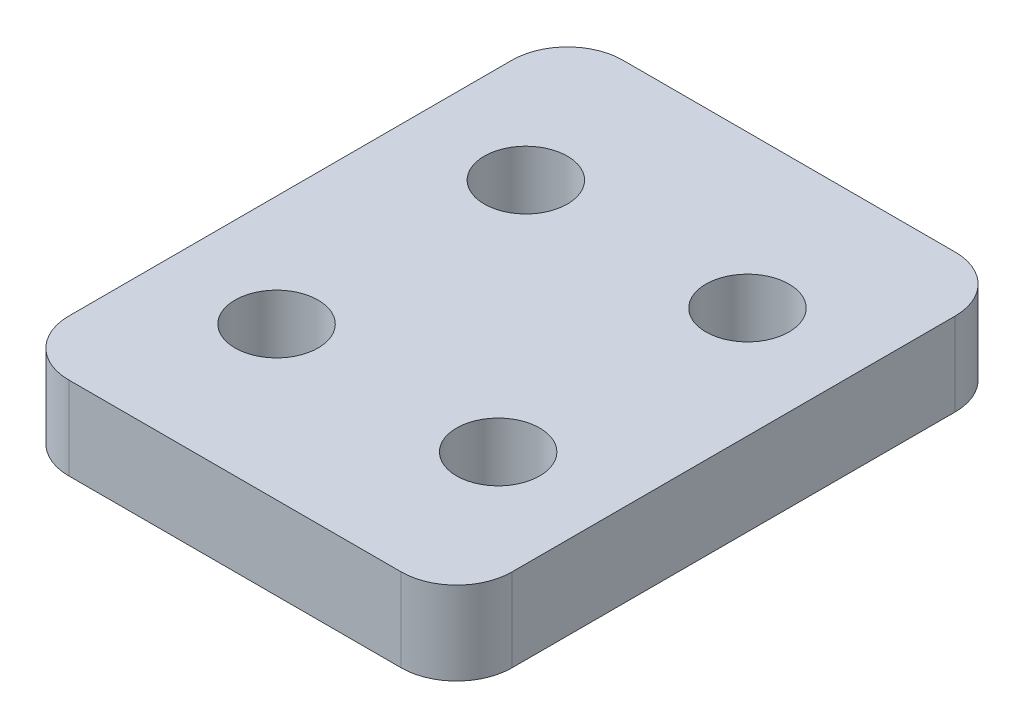
ISO-10303-21;
HEADER;
FILE_DESCRIPTION(('STEP AP214'),'2;1');
FILE_NAME('part.step','',(''),(''),'','','');
FILE_SCHEMA(('AUTOMOTIVE_DESIGN { 1 0 10303 214 1 1 1 1 }'));
ENDSEC;
DATA;
#1=APPLICATION_CONTEXT('core data for automotive mechanical design processes');
#2=APPLICATION_PROTOCOL_DEFINITION('international standard','automotive_design',2000,#1);
#3=PRODUCT_CONTEXT('',#1,'mechanical');
#4=PRODUCT('Part','Part','',(#3));
#5=PRODUCT_RELATED_PRODUCT_CATEGORY('part','',(#4));
#6=PRODUCT_DEFINITION_FORMATION('','',#4);
#7=PRODUCT_DEFINITION_CONTEXT('part definition',#1,'design');
#8=PRODUCT_DEFINITION('design','',#6,#7);
#9=PRODUCT_DEFINITION_SHAPE('','',#8);
#10=(LENGTH_UNIT() NAMED_UNIT(*) SI_UNIT(.MILLI.,.METRE.));
#11=(NAMED_UNIT(*) PLANE_ANGLE_UNIT() SI_UNIT($,.RADIAN.));
#12=(NAMED_UNIT(*) SI_UNIT($,.STERADIAN.) SOLID_ANGLE_UNIT());
#13=UNCERTAINTY_MEASURE_WITH_UNIT(LENGTH_MEASURE(1.E-05),#10,'distance_accuracy_value','');
#14=(GEOMETRIC_REPRESENTATION_CONTEXT(3) GLOBAL_UNCERTAINTY_ASSIGNED_CONTEXT((#13)) GLOBAL_UNIT_ASSIGNED_CONTEXT((#10,
#11,#12)) REPRESENTATION_CONTEXT('',''));
#15=CARTESIAN_POINT('',(0.,0.,0.));
#16=DIRECTION('',(0.,0.,1.));
#17=DIRECTION('',(1.,0.,0.));
#18=AXIS2_PLACEMENT_3D('',#15,#16,#17);
#19=CARTESIAN_POINT('',(8.,1.5,10.));
#20=DIRECTION('',(-1.,0.,0.));
#21=DIRECTION('',(0.,0.,1.));
#22=AXIS2_PLACEMENT_3D('',#19,#20,#21);
#23=PLANE('',#22);
#24=DIRECTION('',(0.,0.,-1.));
#25=VECTOR('',#24,1.);
#26=CARTESIAN_POINT('',(8.,1.5,10.));
#27=LINE('',#26,#25);
#28=CARTESIAN_POINT('',(8.,1.5,8.));
#29=VERTEX_POINT('',#28);
#30=CARTESIAN_POINT('',(8.,1.5,-8.));
#31=VERTEX_POINT('',#30);
#32=EDGE_CURVE('E136',#29,#31,#27,.T.);
#33=ORIENTED_EDGE('',*,*,#32,.F.);
#34=DIRECTION('',(0.,-1.,0.));
#35=VECTOR('',#34,1.);
#36=CARTESIAN_POINT('',(8.,1.5,8.));
#37=LINE('',#36,#35);
#38=CARTESIAN_POINT('',(8.,-1.5,8.));
#39=VERTEX_POINT('',#38);
#40=EDGE_CURVE('E11',#29,#39,#37,.T.);
#41=ORIENTED_EDGE('',*,*,#40,.T.);
#42=DIRECTION('',(0.,0.,-1.));
#43=VECTOR('',#42,1.);
#44=CARTESIAN_POINT('',(8.,-1.5,10.));
#45=LINE('',#44,#43);
#46=CARTESIAN_POINT('',(8.,-1.5,-8.));
#47=VERTEX_POINT('',#46);
#48=EDGE_CURVE('E138',#39,#47,#45,.T.);
#49=ORIENTED_EDGE('',*,*,#48,.T.);
#50=DIRECTION('',(0.,-1.,0.));
#51=VECTOR('',#50,1.);
#52=CARTESIAN_POINT('',(8.,1.5,-8.));
#53=LINE('',#52,#51);
#54=EDGE_CURVE('E49',#47,#31,#53,.F.);
#55=ORIENTED_EDGE('',*,*,#54,.T.);
#56=EDGE_LOOP('',(#33,#41,#49,#55));
#57=FACE_BOUND('',#56,.T.);
#58=ADVANCED_FACE('F41',(#57),#23,.F.);
#59=CARTESIAN_POINT('',(-8.,1.5,-10.));
#60=DIRECTION('',(0.,0.,1.));
#61=DIRECTION('',(1.,0.,0.));
#62=AXIS2_PLACEMENT_3D('',#59,#60,#61);
#63=PLANE('',#62);
#64=DIRECTION('',(-1.,0.,0.));
#65=VECTOR('',#64,1.);
#66=CARTESIAN_POINT('',(-8.,-1.5,-10.));
#67=LINE('',#66,#65);
#68=CARTESIAN_POINT('',(6.,-1.5,-10.));
#69=VERTEX_POINT('',#68);
#70=CARTESIAN_POINT('',(-6.,-1.5,-10.));
#71=VERTEX_POINT('',#70);
#72=EDGE_CURVE('E134',#69,#71,#67,.T.);
#73=ORIENTED_EDGE('',*,*,#72,.T.);
#74=DIRECTION('',(0.,-1.,0.));
#75=VECTOR('',#74,1.);
#76=CARTESIAN_POINT('',(-6.,1.5,-10.));
#77=LINE('',#76,#75);
#78=CARTESIAN_POINT('',(-6.,1.5,-10.));
#79=VERTEX_POINT('',#78);
#80=EDGE_CURVE('E113',#71,#79,#77,.F.);
#81=ORIENTED_EDGE('',*,*,#80,.T.);
#82=DIRECTION('',(-1.,0.,0.));
#83=VECTOR('',#82,1.);
#84=CARTESIAN_POINT('',(-8.,1.5,-10.));
#85=LINE('',#84,#83);
#86=CARTESIAN_POINT('',(6.,1.5,-10.));
#87=VERTEX_POINT('',#86);
#88=EDGE_CURVE('E174',#87,#79,#85,.T.);
#89=ORIENTED_EDGE('',*,*,#88,.F.);
#90=DIRECTION('',(0.,-1.,0.));
#91=VECTOR('',#90,1.);
#92=CARTESIAN_POINT('',(6.,1.5,-10.));
#93=LINE('',#92,#91);
#94=EDGE_CURVE('E118',#87,#69,#93,.T.);
#95=ORIENTED_EDGE('',*,*,#94,.T.);
#96=EDGE_LOOP('',(#73,#81,#89,#95));
#97=FACE_BOUND('',#96,.T.);
#98=ADVANCED_FACE('F178',(#97),#63,.F.);
#99=CARTESIAN_POINT('',(-8.,1.5,10.));
#100=DIRECTION('',(1.,0.,0.));
#101=DIRECTION('',(0.,0.,-1.));
#102=AXIS2_PLACEMENT_3D('',#99,#100,#101);
#103=PLANE('',#102);
#104=DIRECTION('',(0.,0.,1.));
#105=VECTOR('',#104,1.);
#106=CARTESIAN_POINT('',(-8.,1.5,10.));
#107=LINE('',#106,#105);
#108=CARTESIAN_POINT('',(-8.,1.5,-8.));
#109=VERTEX_POINT('',#108);
#110=CARTESIAN_POINT('',(-8.,1.5,8.));
#111=VERTEX_POINT('',#110);
#112=EDGE_CURVE('E127',#109,#111,#107,.T.);
#113=ORIENTED_EDGE('',*,*,#112,.F.);
#114=DIRECTION('',(0.,-1.,0.));
#115=VECTOR('',#114,1.);
#116=CARTESIAN_POINT('',(-8.,1.5,-8.));
#117=LINE('',#116,#115);
#118=CARTESIAN_POINT('',(-8.,-1.5,-8.));
#119=VERTEX_POINT('',#118);
#120=EDGE_CURVE('E112',#109,#119,#117,.T.);
#121=ORIENTED_EDGE('',*,*,#120,.T.);
#122=DIRECTION('',(0.,0.,1.));
#123=VECTOR('',#122,1.);
#124=CARTESIAN_POINT('',(-8.,-1.5,10.));
#125=LINE('',#124,#123);
#126=CARTESIAN_POINT('',(-8.,-1.5,8.));
#127=VERTEX_POINT('',#126);
#128=EDGE_CURVE('E125',#119,#127,#125,.T.);
#129=ORIENTED_EDGE('',*,*,#128,.T.);
#130=DIRECTION('',(0.,-1.,0.));
#131=VECTOR('',#130,1.);
#132=CARTESIAN_POINT('',(-8.,1.5,8.));
#133=LINE('',#132,#131);
#134=EDGE_CURVE('E129',#127,#111,#133,.F.);
#135=ORIENTED_EDGE('',*,*,#134,.T.);
#136=EDGE_LOOP('',(#113,#121,#129,#135));
#137=FACE_BOUND('',#136,.T.);
#138=ADVANCED_FACE('F124',(#137),#103,.F.);
#139=CARTESIAN_POINT('',(-8.,1.5,10.));
#140=DIRECTION('',(0.,0.,-1.));
#141=DIRECTION('',(-1.,0.,0.));
#142=AXIS2_PLACEMENT_3D('',#139,#140,#141);
#143=PLANE('',#142);
#144=DIRECTION('',(1.,0.,0.));
#145=VECTOR('',#144,1.);
#146=CARTESIAN_POINT('',(-8.,1.5,10.));
#147=LINE('',#146,#145);
#148=CARTESIAN_POINT('',(-6.,1.5,10.));
#149=VERTEX_POINT('',#148);
#150=CARTESIAN_POINT('',(6.,1.5,10.));
#151=VERTEX_POINT('',#150);
#152=EDGE_CURVE('E142',#149,#151,#147,.T.);
#153=ORIENTED_EDGE('',*,*,#152,.F.);
#154=DIRECTION('',(0.,-1.,0.));
#155=VECTOR('',#154,1.);
#156=CARTESIAN_POINT('',(-6.,1.5,10.));
#157=LINE('',#156,#155);
#158=CARTESIAN_POINT('',(-6.,-1.5,10.));
#159=VERTEX_POINT('',#158);
#160=EDGE_CURVE('E159',#149,#159,#157,.T.);
#161=ORIENTED_EDGE('',*,*,#160,.T.);
#162=DIRECTION('',(1.,0.,0.));
#163=VECTOR('',#162,1.);
#164=CARTESIAN_POINT('',(-8.,-1.5,10.));
#165=LINE('',#164,#163);
#166=CARTESIAN_POINT('',(6.,-1.5,10.));
#167=VERTEX_POINT('',#166);
#168=EDGE_CURVE('E133',#159,#167,#165,.T.);
#169=ORIENTED_EDGE('',*,*,#168,.T.);
#170=DIRECTION('',(0.,-1.,0.));
#171=VECTOR('',#170,1.);
#172=CARTESIAN_POINT('',(6.,1.5,10.));
#173=LINE('',#172,#171);
#174=EDGE_CURVE('E56',#167,#151,#173,.F.);
#175=ORIENTED_EDGE('',*,*,#174,.T.);
#176=EDGE_LOOP('',(#153,#161,#169,#175));
#177=FACE_BOUND('',#176,.T.);
#178=ADVANCED_FACE('F212',(#177),#143,.F.);
#179=CARTESIAN_POINT('',(0.,1.5,0.));
#180=DIRECTION('',(0.,-1.,0.));
#181=DIRECTION('',(0.,0.,-1.));
#182=AXIS2_PLACEMENT_3D('',#179,#180,#181);
#183=PLANE('',#182);
#184=CARTESIAN_POINT('',(4.,1.5,4.5));
#185=DIRECTION('',(0.,1.,0.));
#186=DIRECTION('',(0.,0.,1.));
#187=AXIS2_PLACEMENT_3D('',#184,#185,#186);
#188=CIRCLE('',#187,1.5);
#189=CARTESIAN_POINT('',(4.,1.5,6.));
#190=VERTEX_POINT('',#189);
#191=EDGE_CURVE('E193',#190,#190,#188,.T.);
#192=ORIENTED_EDGE('',*,*,#191,.F.);
#193=EDGE_LOOP('',(#192));
#194=FACE_BOUND('',#193,.T.);
#195=CARTESIAN_POINT('',(4.,1.5,-4.5));
#196=DIRECTION('',(0.,1.,0.));
#197=DIRECTION('',(0.,0.,1.));
#198=AXIS2_PLACEMENT_3D('',#195,#196,#197);
#199=CIRCLE('',#198,1.5);
#200=CARTESIAN_POINT('',(4.,1.5,-3.));
#201=VERTEX_POINT('',#200);
#202=EDGE_CURVE('E199',#201,#201,#199,.T.);
#203=ORIENTED_EDGE('',*,*,#202,.F.);
#204=EDGE_LOOP('',(#203));
#205=FACE_BOUND('',#204,.T.);
#206=CARTESIAN_POINT('',(-4.,1.5,-4.5));
#207=DIRECTION('',(0.,1.,0.));
#208=DIRECTION('',(0.,0.,1.));
#209=AXIS2_PLACEMENT_3D('',#206,#207,#208);
#210=CIRCLE('',#209,1.5);
#211=CARTESIAN_POINT('',(-4.,1.5,-3.));
#212=VERTEX_POINT('',#211);
#213=EDGE_CURVE('E188',#212,#212,#210,.T.);
#214=ORIENTED_EDGE('',*,*,#213,.F.);
#215=EDGE_LOOP('',(#214));
#216=FACE_BOUND('',#215,.T.);
#217=CARTESIAN_POINT('',(-4.,1.5,4.5));
#218=DIRECTION('',(0.,1.,0.));
#219=DIRECTION('',(0.,0.,1.));
#220=AXIS2_PLACEMENT_3D('',#217,#218,#219);
#221=CIRCLE('',#220,1.5);
#222=CARTESIAN_POINT('',(-4.,1.5,6.));
#223=VERTEX_POINT('',#222);
#224=EDGE_CURVE('E181',#223,#223,#221,.T.);
#225=ORIENTED_EDGE('',*,*,#224,.F.);
#226=EDGE_LOOP('',(#225));
#227=FACE_BOUND('',#226,.T.);
#228=ORIENTED_EDGE('',*,*,#88,.T.);
#229=CARTESIAN_POINT('',(-6.,1.5,-8.));
#230=DIRECTION('',(0.,-1.,0.));
#231=DIRECTION('',(0.,0.,-1.));
#232=AXIS2_PLACEMENT_3D('',#229,#230,#231);
#233=CIRCLE('',#232,2.);
#234=EDGE_CURVE('E156',#79,#109,#233,.F.);
#235=ORIENTED_EDGE('',*,*,#234,.T.);
#236=ORIENTED_EDGE('',*,*,#112,.T.);
#237=CARTESIAN_POINT('',(-6.,1.5,8.));
#238=DIRECTION('',(0.,-1.,0.));
#239=DIRECTION('',(0.,0.,-1.));
#240=AXIS2_PLACEMENT_3D('',#237,#238,#239);
#241=CIRCLE('',#240,2.);
#242=EDGE_CURVE('E63',#111,#149,#241,.F.);
#243=ORIENTED_EDGE('',*,*,#242,.T.);
#244=ORIENTED_EDGE('',*,*,#152,.T.);
#245=CARTESIAN_POINT('',(6.,1.5,8.));
#246=DIRECTION('',(0.,-1.,0.));
#247=DIRECTION('',(0.,0.,-1.));
#248=AXIS2_PLACEMENT_3D('',#245,#246,#247);
#249=CIRCLE('',#248,2.);
#250=EDGE_CURVE('E153',#151,#29,#249,.F.);
#251=ORIENTED_EDGE('',*,*,#250,.T.);
#252=ORIENTED_EDGE('',*,*,#32,.T.);
#253=CARTESIAN_POINT('',(6.,1.5,-8.));
#254=DIRECTION('',(0.,-1.,0.));
#255=DIRECTION('',(0.,0.,-1.));
#256=AXIS2_PLACEMENT_3D('',#253,#254,#255);
#257=CIRCLE('',#256,2.);
#258=EDGE_CURVE('E151',#31,#87,#257,.F.);
#259=ORIENTED_EDGE('',*,*,#258,.T.);
#260=EDGE_LOOP('',(#228,#235,#236,#243,#244,#251,#252,#259));
#261=FACE_BOUND('',#260,.T.);
#262=ADVANCED_FACE('F171',(#194,#205,#216,#227,#261),#183,.F.);
#263=CARTESIAN_POINT('',(0.,-1.5,0.));
#264=DIRECTION('',(0.,-1.,0.));
#265=DIRECTION('',(0.,0.,-1.));
#266=AXIS2_PLACEMENT_3D('',#263,#264,#265);
#267=PLANE('',#266);
#268=CARTESIAN_POINT('',(4.,-1.5,4.5));
#269=DIRECTION('',(0.,1.,0.));
#270=DIRECTION('',(0.,0.,1.));
#271=AXIS2_PLACEMENT_3D('',#268,#269,#270);
#272=CIRCLE('',#271,1.5);
#273=CARTESIAN_POINT('',(4.,-1.5,6.));
#274=VERTEX_POINT('',#273);
#275=EDGE_CURVE('E190',#274,#274,#272,.T.);
#276=ORIENTED_EDGE('',*,*,#275,.T.);
#277=EDGE_LOOP('',(#276));
#278=FACE_BOUND('',#277,.T.);
#279=CARTESIAN_POINT('',(4.,-1.5,-4.5));
#280=DIRECTION('',(0.,1.,0.));
#281=DIRECTION('',(0.,0.,1.));
#282=AXIS2_PLACEMENT_3D('',#279,#280,#281);
#283=CIRCLE('',#282,1.5);
#284=CARTESIAN_POINT('',(4.,-1.5,-3.));
#285=VERTEX_POINT('',#284);
#286=EDGE_CURVE('E196',#285,#285,#283,.T.);
#287=ORIENTED_EDGE('',*,*,#286,.T.);
#288=EDGE_LOOP('',(#287));
#289=FACE_BOUND('',#288,.T.);
#290=CARTESIAN_POINT('',(-4.,-1.5,-4.5));
#291=DIRECTION('',(0.,1.,0.));
#292=DIRECTION('',(0.,0.,1.));
#293=AXIS2_PLACEMENT_3D('',#290,#291,#292);
#294=CIRCLE('',#293,1.5);
#295=CARTESIAN_POINT('',(-4.,-1.5,-3.));
#296=VERTEX_POINT('',#295);
#297=EDGE_CURVE('E202',#296,#296,#294,.T.);
#298=ORIENTED_EDGE('',*,*,#297,.T.);
#299=EDGE_LOOP('',(#298));
#300=FACE_BOUND('',#299,.T.);
#301=CARTESIAN_POINT('',(-4.,-1.5,4.5));
#302=DIRECTION('',(0.,1.,0.));
#303=DIRECTION('',(0.,0.,1.));
#304=AXIS2_PLACEMENT_3D('',#301,#302,#303);
#305=CIRCLE('',#304,1.5);
#306=CARTESIAN_POINT('',(-4.,-1.5,6.));
#307=VERTEX_POINT('',#306);
#308=EDGE_CURVE('E179',#307,#307,#305,.T.);
#309=ORIENTED_EDGE('',*,*,#308,.T.);
#310=EDGE_LOOP('',(#309));
#311=FACE_BOUND('',#310,.T.);
#312=ORIENTED_EDGE('',*,*,#128,.F.);
#313=CARTESIAN_POINT('',(-6.,-1.5,-8.));
#314=DIRECTION('',(0.,-1.,0.));
#315=DIRECTION('',(0.,0.,-1.));
#316=AXIS2_PLACEMENT_3D('',#313,#314,#315);
#317=CIRCLE('',#316,2.);
#318=EDGE_CURVE('E108',#119,#71,#317,.T.);
#319=ORIENTED_EDGE('',*,*,#318,.T.);
#320=ORIENTED_EDGE('',*,*,#72,.F.);
#321=CARTESIAN_POINT('',(6.,-1.5,-8.));
#322=DIRECTION('',(0.,-1.,0.));
#323=DIRECTION('',(0.,0.,-1.));
#324=AXIS2_PLACEMENT_3D('',#321,#322,#323);
#325=CIRCLE('',#324,2.);
#326=EDGE_CURVE('E128',#69,#47,#325,.T.);
#327=ORIENTED_EDGE('',*,*,#326,.T.);
#328=ORIENTED_EDGE('',*,*,#48,.F.);
#329=CARTESIAN_POINT('',(6.,-1.5,8.));
#330=DIRECTION('',(0.,-1.,0.));
#331=DIRECTION('',(0.,0.,-1.));
#332=AXIS2_PLACEMENT_3D('',#329,#330,#331);
#333=CIRCLE('',#332,2.);
#334=EDGE_CURVE('E145',#39,#167,#333,.T.);
#335=ORIENTED_EDGE('',*,*,#334,.T.);
#336=ORIENTED_EDGE('',*,*,#168,.F.);
#337=CARTESIAN_POINT('',(-6.,-1.5,8.));
#338=DIRECTION('',(0.,-1.,0.));
#339=DIRECTION('',(0.,0.,-1.));
#340=AXIS2_PLACEMENT_3D('',#337,#338,#339);
#341=CIRCLE('',#340,2.);
#342=EDGE_CURVE('E119',#159,#127,#341,.T.);
#343=ORIENTED_EDGE('',*,*,#342,.T.);
#344=EDGE_LOOP('',(#312,#319,#320,#327,#328,#335,#336,#343));
#345=FACE_BOUND('',#344,.T.);
#346=ADVANCED_FACE('F131',(#278,#289,#300,#311,#345),#267,.T.);
#347=CARTESIAN_POINT('',(-4.,-1.5,4.5));
#348=DIRECTION('',(0.,1.,0.));
#349=DIRECTION('',(0.,0.,1.));
#350=AXIS2_PLACEMENT_3D('',#347,#348,#349);
#351=CYLINDRICAL_SURFACE('',#350,1.5);
#352=ORIENTED_EDGE('',*,*,#308,.F.);
#353=EDGE_LOOP('',(#352));
#354=FACE_BOUND('',#353,.T.);
#355=ORIENTED_EDGE('',*,*,#224,.T.);
#356=EDGE_LOOP('',(#355));
#357=FACE_BOUND('',#356,.T.);
#358=ADVANCED_FACE('F217',(#354,#357),#351,.F.);
#359=CARTESIAN_POINT('',(-4.,-1.5,-4.5));
#360=DIRECTION('',(0.,1.,0.));
#361=DIRECTION('',(0.,0.,1.));
#362=AXIS2_PLACEMENT_3D('',#359,#360,#361);
#363=CYLINDRICAL_SURFACE('',#362,1.5);
#364=ORIENTED_EDGE('',*,*,#297,.F.);
#365=EDGE_LOOP('',(#364));
#366=FACE_BOUND('',#365,.T.);
#367=ORIENTED_EDGE('',*,*,#213,.T.);
#368=EDGE_LOOP('',(#367));
#369=FACE_BOUND('',#368,.T.);
#370=ADVANCED_FACE('F208',(#366,#369),#363,.F.);
#371=CARTESIAN_POINT('',(4.,-1.5,-4.5));
#372=DIRECTION('',(0.,1.,0.));
#373=DIRECTION('',(0.,0.,1.));
#374=AXIS2_PLACEMENT_3D('',#371,#372,#373);
#375=CYLINDRICAL_SURFACE('',#374,1.5);
#376=ORIENTED_EDGE('',*,*,#286,.F.);
#377=EDGE_LOOP('',(#376));
#378=FACE_BOUND('',#377,.T.);
#379=ORIENTED_EDGE('',*,*,#202,.T.);
#380=EDGE_LOOP('',(#379));
#381=FACE_BOUND('',#380,.T.);
#382=ADVANCED_FACE('F224',(#378,#381),#375,.F.);
#383=CARTESIAN_POINT('',(4.,-1.5,4.5));
#384=DIRECTION('',(0.,1.,0.));
#385=DIRECTION('',(0.,0.,1.));
#386=AXIS2_PLACEMENT_3D('',#383,#384,#385);
#387=CYLINDRICAL_SURFACE('',#386,1.5);
#388=ORIENTED_EDGE('',*,*,#275,.F.);
#389=EDGE_LOOP('',(#388));
#390=FACE_BOUND('',#389,.T.);
#391=ORIENTED_EDGE('',*,*,#191,.T.);
#392=EDGE_LOOP('',(#391));
#393=FACE_BOUND('',#392,.T.);
#394=ADVANCED_FACE('F244',(#390,#393),#387,.F.);
#395=CARTESIAN_POINT('',(-6.,1.5,-8.));
#396=DIRECTION('',(0.,-1.,0.));
#397=DIRECTION('',(0.,0.,-1.));
#398=AXIS2_PLACEMENT_3D('',#395,#396,#397);
#399=CYLINDRICAL_SURFACE('',#398,2.);
#400=ORIENTED_EDGE('',*,*,#234,.F.);
#401=ORIENTED_EDGE('',*,*,#80,.F.);
#402=ORIENTED_EDGE('',*,*,#318,.F.);
#403=ORIENTED_EDGE('',*,*,#120,.F.);
#404=EDGE_LOOP('',(#400,#401,#402,#403));
#405=FACE_BOUND('',#404,.T.);
#406=ADVANCED_FACE('F111',(#405),#399,.T.);
#407=CARTESIAN_POINT('',(-6.,1.5,8.));
#408=DIRECTION('',(0.,-1.,0.));
#409=DIRECTION('',(0.,0.,-1.));
#410=AXIS2_PLACEMENT_3D('',#407,#408,#409);
#411=CYLINDRICAL_SURFACE('',#410,2.);
#412=ORIENTED_EDGE('',*,*,#242,.F.);
#413=ORIENTED_EDGE('',*,*,#134,.F.);
#414=ORIENTED_EDGE('',*,*,#342,.F.);
#415=ORIENTED_EDGE('',*,*,#160,.F.);
#416=EDGE_LOOP('',(#412,#413,#414,#415));
#417=FACE_BOUND('',#416,.T.);
#418=ADVANCED_FACE('F243',(#417),#411,.T.);
#419=CARTESIAN_POINT('',(6.,1.5,8.));
#420=DIRECTION('',(0.,-1.,0.));
#421=DIRECTION('',(0.,0.,-1.));
#422=AXIS2_PLACEMENT_3D('',#419,#420,#421);
#423=CYLINDRICAL_SURFACE('',#422,2.);
#424=ORIENTED_EDGE('',*,*,#250,.F.);
#425=ORIENTED_EDGE('',*,*,#174,.F.);
#426=ORIENTED_EDGE('',*,*,#334,.F.);
#427=ORIENTED_EDGE('',*,*,#40,.F.);
#428=EDGE_LOOP('',(#424,#425,#426,#427));
#429=FACE_BOUND('',#428,.T.);
#430=ADVANCED_FACE('F246',(#429),#423,.T.);
#431=CARTESIAN_POINT('',(6.,1.5,-8.));
#432=DIRECTION('',(0.,-1.,0.));
#433=DIRECTION('',(0.,0.,-1.));
#434=AXIS2_PLACEMENT_3D('',#431,#432,#433);
#435=CYLINDRICAL_SURFACE('',#434,2.);
#436=ORIENTED_EDGE('',*,*,#258,.F.);
#437=ORIENTED_EDGE('',*,*,#54,.F.);
#438=ORIENTED_EDGE('',*,*,#326,.F.);
#439=ORIENTED_EDGE('',*,*,#94,.F.);
#440=EDGE_LOOP('',(#436,#437,#438,#439));
#441=FACE_BOUND('',#440,.T.);
#442=ADVANCED_FACE('F43',(#441),#435,.T.);
#443=CLOSED_SHELL('',(#58,#98,#138,#178,#262,#346,#358,#370,#382,#394,#406,#418,#430,#442));
#444=MANIFOLD_SOLID_BREP('B2',#443);
#445=ADVANCED_BREP_SHAPE_REPRESENTATION('',(#18,#444),#14);
#446=SHAPE_DEFINITION_REPRESENTATION(#9,#445);
ENDSEC;
END-ISO-10303-21;
